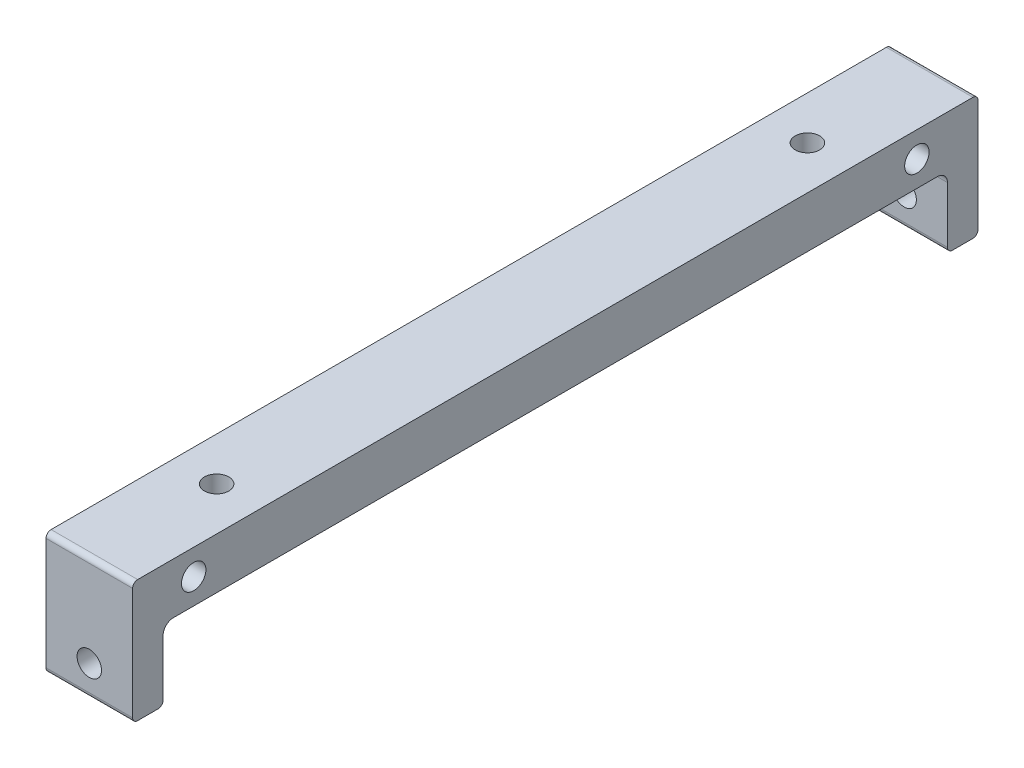
ISO-10303-21;
HEADER;
FILE_DESCRIPTION(('STEP AP214'),'2;1');
FILE_NAME('part.step','',(''),(''),'','','');
FILE_SCHEMA(('AUTOMOTIVE_DESIGN { 1 0 10303 214 1 1 1 1 }'));
ENDSEC;
DATA;
#1=APPLICATION_CONTEXT('core data for automotive mechanical design processes');
#2=APPLICATION_PROTOCOL_DEFINITION('international standard','automotive_design',2000,#1);
#3=PRODUCT_CONTEXT('',#1,'mechanical');
#4=PRODUCT('Part','Part','',(#3));
#5=PRODUCT_RELATED_PRODUCT_CATEGORY('part','',(#4));
#6=PRODUCT_DEFINITION_FORMATION('','',#4);
#7=PRODUCT_DEFINITION_CONTEXT('part definition',#1,'design');
#8=PRODUCT_DEFINITION('design','',#6,#7);
#9=PRODUCT_DEFINITION_SHAPE('','',#8);
#10=(LENGTH_UNIT() NAMED_UNIT(*) SI_UNIT(.MILLI.,.METRE.));
#11=(NAMED_UNIT(*) PLANE_ANGLE_UNIT() SI_UNIT($,.RADIAN.));
#12=(NAMED_UNIT(*) SI_UNIT($,.STERADIAN.) SOLID_ANGLE_UNIT());
#13=UNCERTAINTY_MEASURE_WITH_UNIT(LENGTH_MEASURE(1.E-05),#10,'distance_accuracy_value','');
#14=(GEOMETRIC_REPRESENTATION_CONTEXT(3) GLOBAL_UNCERTAINTY_ASSIGNED_CONTEXT((#13)) GLOBAL_UNIT_ASSIGNED_CONTEXT((#10,
#11,#12)) REPRESENTATION_CONTEXT('',''));
#15=CARTESIAN_POINT('',(0.,0.,0.));
#16=DIRECTION('',(0.,0.,1.));
#17=DIRECTION('',(1.,0.,0.));
#18=AXIS2_PLACEMENT_3D('',#15,#16,#17);
#19=CARTESIAN_POINT('',(-4.25,-6.,41.5));
#20=DIRECTION('',(0.,1.,0.));
#21=DIRECTION('',(0.,0.,1.));
#22=AXIS2_PLACEMENT_3D('',#19,#20,#21);
#23=PLANE('',#22);
#24=DIRECTION('',(0.,0.,-1.));
#25=VECTOR('',#24,1.);
#26=CARTESIAN_POINT('',(-4.25,-6.,41.5));
#27=LINE('',#26,#25);
#28=CARTESIAN_POINT('',(-4.25,-6.,41.));
#29=VERTEX_POINT('',#28);
#30=CARTESIAN_POINT('',(-4.25,-6.,39.));
#31=VERTEX_POINT('',#30);
#32=EDGE_CURVE('E274',#29,#31,#27,.T.);
#33=ORIENTED_EDGE('',*,*,#32,.T.);
#34=DIRECTION('',(1.,0.,0.));
#35=VECTOR('',#34,1.);
#36=CARTESIAN_POINT('',(-4.25,-6.,39.));
#37=LINE('',#36,#35);
#38=CARTESIAN_POINT('',(4.25,-6.,39.));
#39=VERTEX_POINT('',#38);
#40=EDGE_CURVE('E319',#31,#39,#37,.T.);
#41=ORIENTED_EDGE('',*,*,#40,.T.);
#42=DIRECTION('',(0.,0.,-1.));
#43=VECTOR('',#42,1.);
#44=CARTESIAN_POINT('',(4.25,-6.,41.5));
#45=LINE('',#44,#43);
#46=CARTESIAN_POINT('',(4.25,-6.,41.));
#47=VERTEX_POINT('',#46);
#48=EDGE_CURVE('E270',#47,#39,#45,.T.);
#49=ORIENTED_EDGE('',*,*,#48,.F.);
#50=DIRECTION('',(1.,0.,0.));
#51=VECTOR('',#50,1.);
#52=CARTESIAN_POINT('',(-4.25,-6.,41.));
#53=LINE('',#52,#51);
#54=EDGE_CURVE('E317',#47,#29,#53,.F.);
#55=ORIENTED_EDGE('',*,*,#54,.T.);
#56=EDGE_LOOP('',(#33,#41,#49,#55));
#57=FACE_BOUND('',#56,.T.);
#58=ADVANCED_FACE('F34',(#57),#23,.F.);
#59=CARTESIAN_POINT('',(4.25,-6.,41.5));
#60=DIRECTION('',(-1.,0.,0.));
#61=DIRECTION('',(0.,0.,1.));
#62=AXIS2_PLACEMENT_3D('',#59,#60,#61);
#63=PLANE('',#62);
#64=CARTESIAN_POINT('',(4.25,3.5,35.5));
#65=DIRECTION('',(1.,0.,0.));
#66=DIRECTION('',(0.,0.,-1.));
#67=AXIS2_PLACEMENT_3D('',#64,#65,#66);
#68=CIRCLE('',#67,1.2);
#69=CARTESIAN_POINT('',(4.25,3.5,34.3));
#70=VERTEX_POINT('',#69);
#71=EDGE_CURVE('E208',#70,#70,#68,.T.);
#72=ORIENTED_EDGE('',*,*,#71,.F.);
#73=EDGE_LOOP('',(#72));
#74=FACE_BOUND('',#73,.T.);
#75=CARTESIAN_POINT('',(4.25,3.5,-35.5));
#76=DIRECTION('',(1.,0.,0.));
#77=DIRECTION('',(0.,0.,-1.));
#78=AXIS2_PLACEMENT_3D('',#75,#76,#77);
#79=CIRCLE('',#78,1.2);
#80=CARTESIAN_POINT('',(4.25,3.5,-36.7));
#81=VERTEX_POINT('',#80);
#82=EDGE_CURVE('E214',#81,#81,#79,.T.);
#83=ORIENTED_EDGE('',*,*,#82,.F.);
#84=EDGE_LOOP('',(#83));
#85=FACE_BOUND('',#84,.T.);
#86=CARTESIAN_POINT('',(4.25,-6.,-39.));
#87=VERTEX_POINT('',#86);
#88=CARTESIAN_POINT('',(4.25,-6.,-41.));
#89=VERTEX_POINT('',#88);
#90=EDGE_CURVE('E265',#87,#89,#45,.T.);
#91=ORIENTED_EDGE('',*,*,#90,.T.);
#92=CARTESIAN_POINT('',(4.25,-5.5,-41.));
#93=DIRECTION('',(-1.,0.,0.));
#94=DIRECTION('',(0.,0.,1.));
#95=AXIS2_PLACEMENT_3D('',#92,#93,#94);
#96=CIRCLE('',#95,0.5);
#97=CARTESIAN_POINT('',(4.25,-5.5,-41.5));
#98=VERTEX_POINT('',#97);
#99=EDGE_CURVE('E298',#89,#98,#96,.F.);
#100=ORIENTED_EDGE('',*,*,#99,.T.);
#101=DIRECTION('',(0.,1.,0.));
#102=VECTOR('',#101,1.);
#103=CARTESIAN_POINT('',(4.25,-6.,-41.5));
#104=LINE('',#103,#102);
#105=CARTESIAN_POINT('',(4.25,5.5,-41.5));
#106=VERTEX_POINT('',#105);
#107=EDGE_CURVE('E251',#98,#106,#104,.T.);
#108=ORIENTED_EDGE('',*,*,#107,.T.);
#109=CARTESIAN_POINT('',(4.25,5.5,-41.));
#110=DIRECTION('',(-1.,0.,0.));
#111=DIRECTION('',(0.,0.,1.));
#112=AXIS2_PLACEMENT_3D('',#109,#110,#111);
#113=CIRCLE('',#112,0.5);
#114=CARTESIAN_POINT('',(4.25,6.,-41.));
#115=VERTEX_POINT('',#114);
#116=EDGE_CURVE('E290',#106,#115,#113,.F.);
#117=ORIENTED_EDGE('',*,*,#116,.T.);
#118=DIRECTION('',(0.,0.,-1.));
#119=VECTOR('',#118,1.);
#120=CARTESIAN_POINT('',(4.25,6.,41.5));
#121=LINE('',#120,#119);
#122=CARTESIAN_POINT('',(4.25,6.,41.));
#123=VERTEX_POINT('',#122);
#124=EDGE_CURVE('E280',#123,#115,#121,.T.);
#125=ORIENTED_EDGE('',*,*,#124,.F.);
#126=CARTESIAN_POINT('',(4.25,5.5,41.));
#127=DIRECTION('',(-1.,0.,0.));
#128=DIRECTION('',(0.,0.,1.));
#129=AXIS2_PLACEMENT_3D('',#126,#127,#128);
#130=CIRCLE('',#129,0.5);
#131=CARTESIAN_POINT('',(4.25,5.5,41.5));
#132=VERTEX_POINT('',#131);
#133=EDGE_CURVE('E288',#123,#132,#130,.F.);
#134=ORIENTED_EDGE('',*,*,#133,.T.);
#135=DIRECTION('',(0.,1.,0.));
#136=VECTOR('',#135,1.);
#137=CARTESIAN_POINT('',(4.25,-6.,41.5));
#138=LINE('',#137,#136);
#139=CARTESIAN_POINT('',(4.25,-5.5,41.5));
#140=VERTEX_POINT('',#139);
#141=EDGE_CURVE('E258',#140,#132,#138,.T.);
#142=ORIENTED_EDGE('',*,*,#141,.F.);
#143=CARTESIAN_POINT('',(4.25,-5.5,41.));
#144=DIRECTION('',(-1.,0.,0.));
#145=DIRECTION('',(0.,0.,1.));
#146=AXIS2_PLACEMENT_3D('',#143,#144,#145);
#147=CIRCLE('',#146,0.5);
#148=EDGE_CURVE('E292',#140,#47,#147,.F.);
#149=ORIENTED_EDGE('',*,*,#148,.T.);
#150=ORIENTED_EDGE('',*,*,#48,.T.);
#151=CARTESIAN_POINT('',(4.25,-5.5,39.));
#152=DIRECTION('',(-1.,0.,0.));
#153=DIRECTION('',(0.,0.,1.));
#154=AXIS2_PLACEMENT_3D('',#151,#152,#153);
#155=CIRCLE('',#154,0.5);
#156=CARTESIAN_POINT('',(4.25,-5.5,38.5));
#157=VERTEX_POINT('',#156);
#158=EDGE_CURVE('E294',#39,#157,#155,.F.);
#159=ORIENTED_EDGE('',*,*,#158,.T.);
#160=DIRECTION('',(0.,-1.,0.));
#161=VECTOR('',#160,1.);
#162=CARTESIAN_POINT('',(4.25,-6.00000000000001,38.5));
#163=LINE('',#162,#161);
#164=CARTESIAN_POINT('',(4.25,0.,38.5));
#165=VERTEX_POINT('',#164);
#166=EDGE_CURVE('E224',#165,#157,#163,.T.);
#167=ORIENTED_EDGE('',*,*,#166,.F.);
#168=CARTESIAN_POINT('',(4.25,0.,37.5));
#169=DIRECTION('',(1.,0.,0.));
#170=DIRECTION('',(0.,0.,-1.));
#171=AXIS2_PLACEMENT_3D('',#168,#169,#170);
#172=CIRCLE('',#171,1.);
#173=CARTESIAN_POINT('',(4.25,1.,37.5));
#174=VERTEX_POINT('',#173);
#175=EDGE_CURVE('E244',#174,#165,#172,.T.);
#176=ORIENTED_EDGE('',*,*,#175,.F.);
#177=DIRECTION('',(0.,0.,1.));
#178=VECTOR('',#177,1.);
#179=CARTESIAN_POINT('',(4.25,1.,37.5));
#180=LINE('',#179,#178);
#181=CARTESIAN_POINT('',(4.25,1.,-37.5));
#182=VERTEX_POINT('',#181);
#183=EDGE_CURVE('E241',#182,#174,#180,.T.);
#184=ORIENTED_EDGE('',*,*,#183,.F.);
#185=CARTESIAN_POINT('',(4.25,0.,-37.5));
#186=DIRECTION('',(1.,0.,0.));
#187=DIRECTION('',(0.,0.,1.));
#188=AXIS2_PLACEMENT_3D('',#185,#186,#187);
#189=CIRCLE('',#188,1.);
#190=CARTESIAN_POINT('',(4.25,0.,-38.5));
#191=VERTEX_POINT('',#190);
#192=EDGE_CURVE('E238',#191,#182,#189,.T.);
#193=ORIENTED_EDGE('',*,*,#192,.F.);
#194=DIRECTION('',(0.,1.,0.));
#195=VECTOR('',#194,1.);
#196=CARTESIAN_POINT('',(4.25,0.,-38.5));
#197=LINE('',#196,#195);
#198=CARTESIAN_POINT('',(4.25,-5.5,-38.5));
#199=VERTEX_POINT('',#198);
#200=EDGE_CURVE('E220',#199,#191,#197,.T.);
#201=ORIENTED_EDGE('',*,*,#200,.F.);
#202=CARTESIAN_POINT('',(4.25,-5.5,-39.));
#203=DIRECTION('',(-1.,0.,0.));
#204=DIRECTION('',(0.,0.,1.));
#205=AXIS2_PLACEMENT_3D('',#202,#203,#204);
#206=CIRCLE('',#205,0.5);
#207=EDGE_CURVE('E296',#199,#87,#206,.F.);
#208=ORIENTED_EDGE('',*,*,#207,.T.);
#209=EDGE_LOOP('',(#91,#100,#108,#117,#125,#134,#142,#149,#150,#159,#167,#176,#184,#193,#201,#208));
#210=FACE_BOUND('',#209,.T.);
#211=ADVANCED_FACE('F338',(#74,#85,#210),#63,.F.);
#212=CARTESIAN_POINT('',(-4.25,6.,41.5));
#213=DIRECTION('',(0.,-1.,0.));
#214=DIRECTION('',(0.,0.,-1.));
#215=AXIS2_PLACEMENT_3D('',#212,#213,#214);
#216=PLANE('',#215);
#217=CARTESIAN_POINT('',(0.,6.,-29.));
#218=DIRECTION('',(0.,1.,0.));
#219=DIRECTION('',(0.,0.,1.));
#220=AXIS2_PLACEMENT_3D('',#217,#218,#219);
#221=CIRCLE('',#220,1.2);
#222=CARTESIAN_POINT('',(0.,6.,-27.8));
#223=VERTEX_POINT('',#222);
#224=EDGE_CURVE('E171',#223,#223,#221,.T.);
#225=ORIENTED_EDGE('',*,*,#224,.F.);
#226=EDGE_LOOP('',(#225));
#227=FACE_BOUND('',#226,.T.);
#228=CARTESIAN_POINT('',(0.,6.,29.));
#229=DIRECTION('',(0.,1.,0.));
#230=DIRECTION('',(0.,0.,1.));
#231=AXIS2_PLACEMENT_3D('',#228,#229,#230);
#232=CIRCLE('',#231,1.2);
#233=CARTESIAN_POINT('',(0.,6.,30.2));
#234=VERTEX_POINT('',#233);
#235=EDGE_CURVE('E184',#234,#234,#232,.T.);
#236=ORIENTED_EDGE('',*,*,#235,.F.);
#237=EDGE_LOOP('',(#236));
#238=FACE_BOUND('',#237,.T.);
#239=ORIENTED_EDGE('',*,*,#124,.T.);
#240=DIRECTION('',(-1.,0.,0.));
#241=VECTOR('',#240,1.);
#242=CARTESIAN_POINT('',(-4.25,6.,-41.));
#243=LINE('',#242,#241);
#244=CARTESIAN_POINT('',(-4.25,6.,-41.));
#245=VERTEX_POINT('',#244);
#246=EDGE_CURVE('E11',#115,#245,#243,.T.);
#247=ORIENTED_EDGE('',*,*,#246,.T.);
#248=DIRECTION('',(0.,0.,-1.));
#249=VECTOR('',#248,1.);
#250=CARTESIAN_POINT('',(-4.25,6.,41.5));
#251=LINE('',#250,#249);
#252=CARTESIAN_POINT('',(-4.25,6.,41.));
#253=VERTEX_POINT('',#252);
#254=EDGE_CURVE('E277',#253,#245,#251,.T.);
#255=ORIENTED_EDGE('',*,*,#254,.F.);
#256=DIRECTION('',(-1.,0.,0.));
#257=VECTOR('',#256,1.);
#258=CARTESIAN_POINT('',(-4.25,6.,41.));
#259=LINE('',#258,#257);
#260=EDGE_CURVE('E42',#253,#123,#259,.F.);
#261=ORIENTED_EDGE('',*,*,#260,.T.);
#262=EDGE_LOOP('',(#239,#247,#255,#261));
#263=FACE_BOUND('',#262,.T.);
#264=ADVANCED_FACE('F333',(#227,#238,#263),#216,.F.);
#265=CARTESIAN_POINT('',(-4.25,-6.,41.5));
#266=DIRECTION('',(1.,0.,0.));
#267=DIRECTION('',(0.,0.,-1.));
#268=AXIS2_PLACEMENT_3D('',#265,#266,#267);
#269=PLANE('',#268);
#270=CARTESIAN_POINT('',(-4.25,3.5,0.));
#271=DIRECTION('',(-1.,0.,0.));
#272=DIRECTION('',(0.,0.,1.));
#273=AXIS2_PLACEMENT_3D('',#270,#271,#272);
#274=CIRCLE('',#273,1.2);
#275=CARTESIAN_POINT('',(-4.25,3.5,1.2));
#276=VERTEX_POINT('',#275);
#277=EDGE_CURVE('E172',#276,#276,#274,.T.);
#278=ORIENTED_EDGE('',*,*,#277,.F.);
#279=EDGE_LOOP('',(#278));
#280=FACE_BOUND('',#279,.T.);
#281=CARTESIAN_POINT('',(-4.25,3.5,-21.5));
#282=DIRECTION('',(-1.,0.,0.));
#283=DIRECTION('',(0.,0.,1.));
#284=AXIS2_PLACEMENT_3D('',#281,#282,#283);
#285=CIRCLE('',#284,1.2);
#286=CARTESIAN_POINT('',(-4.25,3.5,-20.3));
#287=VERTEX_POINT('',#286);
#288=EDGE_CURVE('E196',#287,#287,#285,.T.);
#289=ORIENTED_EDGE('',*,*,#288,.F.);
#290=EDGE_LOOP('',(#289));
#291=FACE_BOUND('',#290,.T.);
#292=CARTESIAN_POINT('',(-4.25,3.5,21.5));
#293=DIRECTION('',(-1.,0.,0.));
#294=DIRECTION('',(0.,0.,1.));
#295=AXIS2_PLACEMENT_3D('',#292,#293,#294);
#296=CIRCLE('',#295,1.2);
#297=CARTESIAN_POINT('',(-4.25,3.5,22.7));
#298=VERTEX_POINT('',#297);
#299=EDGE_CURVE('E202',#298,#298,#296,.T.);
#300=ORIENTED_EDGE('',*,*,#299,.F.);
#301=EDGE_LOOP('',(#300));
#302=FACE_BOUND('',#301,.T.);
#303=DIRECTION('',(0.,-1.,0.));
#304=VECTOR('',#303,1.);
#305=CARTESIAN_POINT('',(-4.25,-6.,-41.5));
#306=LINE('',#305,#304);
#307=CARTESIAN_POINT('',(-4.25,5.5,-41.5));
#308=VERTEX_POINT('',#307);
#309=CARTESIAN_POINT('',(-4.25,-5.5,-41.5));
#310=VERTEX_POINT('',#309);
#311=EDGE_CURVE('E262',#308,#310,#306,.T.);
#312=ORIENTED_EDGE('',*,*,#311,.T.);
#313=CARTESIAN_POINT('',(-4.25,-5.5,-41.));
#314=DIRECTION('',(1.,0.,0.));
#315=DIRECTION('',(0.,0.,-1.));
#316=AXIS2_PLACEMENT_3D('',#313,#314,#315);
#317=CIRCLE('',#316,0.5);
#318=CARTESIAN_POINT('',(-4.25,-6.,-41.));
#319=VERTEX_POINT('',#318);
#320=EDGE_CURVE('E312',#310,#319,#317,.F.);
#321=ORIENTED_EDGE('',*,*,#320,.T.);
#322=CARTESIAN_POINT('',(-4.25,-6.,-39.));
#323=VERTEX_POINT('',#322);
#324=EDGE_CURVE('E273',#323,#319,#27,.T.);
#325=ORIENTED_EDGE('',*,*,#324,.F.);
#326=CARTESIAN_POINT('',(-4.25,-5.5,-39.));
#327=DIRECTION('',(1.,0.,0.));
#328=DIRECTION('',(0.,0.,-1.));
#329=AXIS2_PLACEMENT_3D('',#326,#327,#328);
#330=CIRCLE('',#329,0.5);
#331=CARTESIAN_POINT('',(-4.25,-5.5,-38.5));
#332=VERTEX_POINT('',#331);
#333=EDGE_CURVE('E49',#323,#332,#330,.F.);
#334=ORIENTED_EDGE('',*,*,#333,.T.);
#335=DIRECTION('',(0.,1.,0.));
#336=VECTOR('',#335,1.);
#337=CARTESIAN_POINT('',(-4.25,0.,-38.5));
#338=LINE('',#337,#336);
#339=CARTESIAN_POINT('',(-4.25,0.,-38.5));
#340=VERTEX_POINT('',#339);
#341=EDGE_CURVE('E221',#332,#340,#338,.T.);
#342=ORIENTED_EDGE('',*,*,#341,.T.);
#343=CARTESIAN_POINT('',(-4.25,0.,-37.5));
#344=DIRECTION('',(1.,0.,0.));
#345=DIRECTION('',(0.,0.,1.));
#346=AXIS2_PLACEMENT_3D('',#343,#344,#345);
#347=CIRCLE('',#346,1.);
#348=CARTESIAN_POINT('',(-4.25,1.,-37.5));
#349=VERTEX_POINT('',#348);
#350=EDGE_CURVE('E223',#340,#349,#347,.T.);
#351=ORIENTED_EDGE('',*,*,#350,.T.);
#352=DIRECTION('',(0.,0.,1.));
#353=VECTOR('',#352,1.);
#354=CARTESIAN_POINT('',(-4.25,1.,37.5));
#355=LINE('',#354,#353);
#356=CARTESIAN_POINT('',(-4.25,1.,37.5));
#357=VERTEX_POINT('',#356);
#358=EDGE_CURVE('E227',#349,#357,#355,.T.);
#359=ORIENTED_EDGE('',*,*,#358,.T.);
#360=CARTESIAN_POINT('',(-4.25,0.,37.5));
#361=DIRECTION('',(1.,0.,0.));
#362=DIRECTION('',(0.,0.,-1.));
#363=AXIS2_PLACEMENT_3D('',#360,#361,#362);
#364=CIRCLE('',#363,1.);
#365=CARTESIAN_POINT('',(-4.25,0.,38.5));
#366=VERTEX_POINT('',#365);
#367=EDGE_CURVE('E230',#357,#366,#364,.T.);
#368=ORIENTED_EDGE('',*,*,#367,.T.);
#369=DIRECTION('',(0.,-1.,0.));
#370=VECTOR('',#369,1.);
#371=CARTESIAN_POINT('',(-4.25,-6.00000000000001,38.5));
#372=LINE('',#371,#370);
#373=CARTESIAN_POINT('',(-4.25,-5.5,38.5));
#374=VERTEX_POINT('',#373);
#375=EDGE_CURVE('E233',#366,#374,#372,.T.);
#376=ORIENTED_EDGE('',*,*,#375,.T.);
#377=CARTESIAN_POINT('',(-4.25,-5.5,39.));
#378=DIRECTION('',(1.,0.,0.));
#379=DIRECTION('',(0.,0.,-1.));
#380=AXIS2_PLACEMENT_3D('',#377,#378,#379);
#381=CIRCLE('',#380,0.5);
#382=EDGE_CURVE('E309',#374,#31,#381,.F.);
#383=ORIENTED_EDGE('',*,*,#382,.T.);
#384=ORIENTED_EDGE('',*,*,#32,.F.);
#385=CARTESIAN_POINT('',(-4.25,-5.5,41.));
#386=DIRECTION('',(1.,0.,0.));
#387=DIRECTION('',(0.,0.,-1.));
#388=AXIS2_PLACEMENT_3D('',#385,#386,#387);
#389=CIRCLE('',#388,0.5);
#390=CARTESIAN_POINT('',(-4.25,-5.5,41.5));
#391=VERTEX_POINT('',#390);
#392=EDGE_CURVE('E307',#29,#391,#389,.F.);
#393=ORIENTED_EDGE('',*,*,#392,.T.);
#394=DIRECTION('',(0.,-1.,0.));
#395=VECTOR('',#394,1.);
#396=CARTESIAN_POINT('',(-4.25,-6.,41.5));
#397=LINE('',#396,#395);
#398=CARTESIAN_POINT('',(-4.25,5.5,41.5));
#399=VERTEX_POINT('',#398);
#400=EDGE_CURVE('E261',#399,#391,#397,.T.);
#401=ORIENTED_EDGE('',*,*,#400,.F.);
#402=CARTESIAN_POINT('',(-4.25,5.5,41.));
#403=DIRECTION('',(1.,0.,0.));
#404=DIRECTION('',(0.,0.,-1.));
#405=AXIS2_PLACEMENT_3D('',#402,#403,#404);
#406=CIRCLE('',#405,0.5);
#407=EDGE_CURVE('E304',#399,#253,#406,.F.);
#408=ORIENTED_EDGE('',*,*,#407,.T.);
#409=ORIENTED_EDGE('',*,*,#254,.T.);
#410=CARTESIAN_POINT('',(-4.25,5.5,-41.));
#411=DIRECTION('',(1.,0.,0.));
#412=DIRECTION('',(0.,0.,-1.));
#413=AXIS2_PLACEMENT_3D('',#410,#411,#412);
#414=CIRCLE('',#413,0.5);
#415=EDGE_CURVE('E57',#245,#308,#414,.F.);
#416=ORIENTED_EDGE('',*,*,#415,.T.);
#417=EDGE_LOOP('',(#312,#321,#325,#334,#342,#351,#359,#368,#376,#383,#384,#393,#401,#408,#409,#416));
#418=FACE_BOUND('',#417,.T.);
#419=ADVANCED_FACE('F346',(#280,#291,#302,#418),#269,.F.);
#420=ORIENTED_EDGE('',*,*,#324,.T.);
#421=DIRECTION('',(1.,0.,0.));
#422=VECTOR('',#421,1.);
#423=CARTESIAN_POINT('',(4.25,-6.,-41.));
#424=LINE('',#423,#422);
#425=EDGE_CURVE('E285',#319,#89,#424,.T.);
#426=ORIENTED_EDGE('',*,*,#425,.T.);
#427=ORIENTED_EDGE('',*,*,#90,.F.);
#428=DIRECTION('',(1.,0.,0.));
#429=VECTOR('',#428,1.);
#430=CARTESIAN_POINT('',(-4.25,-6.,-39.));
#431=LINE('',#430,#429);
#432=EDGE_CURVE('E283',#87,#323,#431,.F.);
#433=ORIENTED_EDGE('',*,*,#432,.T.);
#434=EDGE_LOOP('',(#420,#426,#427,#433));
#435=FACE_BOUND('',#434,.T.);
#436=ADVANCED_FACE('F385',(#435),#23,.F.);
#437=CARTESIAN_POINT('',(0.,0.,41.5));
#438=DIRECTION('',(0.,0.,-1.));
#439=DIRECTION('',(-1.,0.,0.));
#440=AXIS2_PLACEMENT_3D('',#437,#438,#439);
#441=PLANE('',#440);
#442=CARTESIAN_POINT('',(0.,-3.,41.5));
#443=DIRECTION('',(0.,0.,1.));
#444=DIRECTION('',(1.,0.,0.));
#445=AXIS2_PLACEMENT_3D('',#442,#443,#444);
#446=CIRCLE('',#445,1.2);
#447=CARTESIAN_POINT('',(1.2,-3.,41.5));
#448=VERTEX_POINT('',#447);
#449=EDGE_CURVE('E190',#448,#448,#446,.T.);
#450=ORIENTED_EDGE('',*,*,#449,.F.);
#451=EDGE_LOOP('',(#450));
#452=FACE_BOUND('',#451,.T.);
#453=ORIENTED_EDGE('',*,*,#400,.T.);
#454=DIRECTION('',(1.,0.,0.));
#455=VECTOR('',#454,1.);
#456=CARTESIAN_POINT('',(0.,-5.5,41.5));
#457=LINE('',#456,#455);
#458=EDGE_CURVE('E327',#391,#140,#457,.T.);
#459=ORIENTED_EDGE('',*,*,#458,.T.);
#460=ORIENTED_EDGE('',*,*,#141,.T.);
#461=DIRECTION('',(-1.,0.,0.));
#462=VECTOR('',#461,1.);
#463=CARTESIAN_POINT('',(0.,5.5,41.5));
#464=LINE('',#463,#462);
#465=EDGE_CURVE('E324',#132,#399,#464,.T.);
#466=ORIENTED_EDGE('',*,*,#465,.T.);
#467=EDGE_LOOP('',(#453,#459,#460,#466));
#468=FACE_BOUND('',#467,.T.);
#469=ADVANCED_FACE('F344',(#452,#468),#441,.F.);
#470=CARTESIAN_POINT('',(0.,0.,-41.5));
#471=DIRECTION('',(0.,0.,-1.));
#472=DIRECTION('',(-1.,0.,0.));
#473=AXIS2_PLACEMENT_3D('',#470,#471,#472);
#474=PLANE('',#473);
#475=CARTESIAN_POINT('',(0.,-3.,-41.5));
#476=DIRECTION('',(0.,0.,-1.));
#477=DIRECTION('',(-1.,0.,0.));
#478=AXIS2_PLACEMENT_3D('',#475,#476,#477);
#479=CIRCLE('',#478,1.19999999999999);
#480=CARTESIAN_POINT('',(-1.19999999999999,-3.,-41.5));
#481=VERTEX_POINT('',#480);
#482=EDGE_CURVE('E480',#481,#481,#479,.T.);
#483=ORIENTED_EDGE('',*,*,#482,.F.);
#484=EDGE_LOOP('',(#483));
#485=FACE_BOUND('',#484,.T.);
#486=ORIENTED_EDGE('',*,*,#107,.F.);
#487=DIRECTION('',(1.,0.,0.));
#488=VECTOR('',#487,1.);
#489=CARTESIAN_POINT('',(-4.25,-5.5,-41.5));
#490=LINE('',#489,#488);
#491=EDGE_CURVE('E302',#98,#310,#490,.F.);
#492=ORIENTED_EDGE('',*,*,#491,.T.);
#493=ORIENTED_EDGE('',*,*,#311,.F.);
#494=DIRECTION('',(-1.,0.,0.));
#495=VECTOR('',#494,1.);
#496=CARTESIAN_POINT('',(4.25,5.5,-41.5));
#497=LINE('',#496,#495);
#498=EDGE_CURVE('E300',#308,#106,#497,.F.);
#499=ORIENTED_EDGE('',*,*,#498,.T.);
#500=EDGE_LOOP('',(#486,#492,#493,#499));
#501=FACE_BOUND('',#500,.T.);
#502=ADVANCED_FACE('F412',(#485,#501),#474,.T.);
#503=CARTESIAN_POINT('',(-4.25,-6.00000000000001,38.5));
#504=DIRECTION('',(0.,0.,1.));
#505=DIRECTION('',(1.,0.,0.));
#506=AXIS2_PLACEMENT_3D('',#503,#504,#505);
#507=PLANE('',#506);
#508=CARTESIAN_POINT('',(0.,-3.,38.5));
#509=DIRECTION('',(0.,0.,1.));
#510=DIRECTION('',(1.,0.,0.));
#511=AXIS2_PLACEMENT_3D('',#508,#509,#510);
#512=CIRCLE('',#511,1.2);
#513=CARTESIAN_POINT('',(1.2,-3.,38.5));
#514=VERTEX_POINT('',#513);
#515=EDGE_CURVE('E193',#514,#514,#512,.T.);
#516=ORIENTED_EDGE('',*,*,#515,.T.);
#517=EDGE_LOOP('',(#516));
#518=FACE_BOUND('',#517,.T.);
#519=ORIENTED_EDGE('',*,*,#166,.T.);
#520=DIRECTION('',(1.,0.,0.));
#521=VECTOR('',#520,1.);
#522=CARTESIAN_POINT('',(-4.25,-5.5,38.5));
#523=LINE('',#522,#521);
#524=EDGE_CURVE('E322',#157,#374,#523,.F.);
#525=ORIENTED_EDGE('',*,*,#524,.T.);
#526=ORIENTED_EDGE('',*,*,#375,.F.);
#527=DIRECTION('',(1.,0.,0.));
#528=VECTOR('',#527,1.);
#529=CARTESIAN_POINT('',(-4.25,0.,38.5));
#530=LINE('',#529,#528);
#531=EDGE_CURVE('E249',#366,#165,#530,.T.);
#532=ORIENTED_EDGE('',*,*,#531,.T.);
#533=EDGE_LOOP('',(#519,#525,#526,#532));
#534=FACE_BOUND('',#533,.T.);
#535=ADVANCED_FACE('F362',(#518,#534),#507,.F.);
#536=CARTESIAN_POINT('',(-4.25,0.,37.5));
#537=DIRECTION('',(1.,0.,0.));
#538=DIRECTION('',(0.,0.,-1.));
#539=AXIS2_PLACEMENT_3D('',#536,#537,#538);
#540=CYLINDRICAL_SURFACE('',#539,1.);
#541=ORIENTED_EDGE('',*,*,#175,.T.);
#542=ORIENTED_EDGE('',*,*,#531,.F.);
#543=ORIENTED_EDGE('',*,*,#367,.F.);
#544=DIRECTION('',(1.,0.,0.));
#545=VECTOR('',#544,1.);
#546=CARTESIAN_POINT('',(-4.25,1.,37.5));
#547=LINE('',#546,#545);
#548=EDGE_CURVE('E252',#357,#174,#547,.T.);
#549=ORIENTED_EDGE('',*,*,#548,.T.);
#550=EDGE_LOOP('',(#541,#542,#543,#549));
#551=FACE_BOUND('',#550,.T.);
#552=ADVANCED_FACE('F366',(#551),#540,.F.);
#553=CARTESIAN_POINT('',(-4.25,1.,37.5));
#554=DIRECTION('',(0.,1.,0.));
#555=DIRECTION('',(0.,0.,1.));
#556=AXIS2_PLACEMENT_3D('',#553,#554,#555);
#557=PLANE('',#556);
#558=CARTESIAN_POINT('',(0.,1.,-29.));
#559=DIRECTION('',(0.,1.,0.));
#560=DIRECTION('',(0.,0.,1.));
#561=AXIS2_PLACEMENT_3D('',#558,#559,#560);
#562=CIRCLE('',#561,1.2);
#563=CARTESIAN_POINT('',(0.,1.,-27.8));
#564=VERTEX_POINT('',#563);
#565=EDGE_CURVE('E175',#564,#564,#562,.T.);
#566=ORIENTED_EDGE('',*,*,#565,.T.);
#567=EDGE_LOOP('',(#566));
#568=FACE_BOUND('',#567,.T.);
#569=CARTESIAN_POINT('',(0.,1.,29.));
#570=DIRECTION('',(0.,1.,0.));
#571=DIRECTION('',(0.,0.,1.));
#572=AXIS2_PLACEMENT_3D('',#569,#570,#571);
#573=CIRCLE('',#572,1.2);
#574=CARTESIAN_POINT('',(0.,1.,30.2));
#575=VERTEX_POINT('',#574);
#576=EDGE_CURVE('E187',#575,#575,#573,.T.);
#577=ORIENTED_EDGE('',*,*,#576,.T.);
#578=EDGE_LOOP('',(#577));
#579=FACE_BOUND('',#578,.T.);
#580=ORIENTED_EDGE('',*,*,#183,.T.);
#581=ORIENTED_EDGE('',*,*,#548,.F.);
#582=ORIENTED_EDGE('',*,*,#358,.F.);
#583=DIRECTION('',(1.,0.,0.));
#584=VECTOR('',#583,1.);
#585=CARTESIAN_POINT('',(-4.25,1.,-37.5));
#586=LINE('',#585,#584);
#587=EDGE_CURVE('E254',#349,#182,#586,.T.);
#588=ORIENTED_EDGE('',*,*,#587,.T.);
#589=EDGE_LOOP('',(#580,#581,#582,#588));
#590=FACE_BOUND('',#589,.T.);
#591=ADVANCED_FACE('F371',(#568,#579,#590),#557,.F.);
#592=CARTESIAN_POINT('',(-4.25,0.,-37.5));
#593=DIRECTION('',(1.,0.,0.));
#594=DIRECTION('',(0.,0.,-1.));
#595=AXIS2_PLACEMENT_3D('',#592,#593,#594);
#596=CYLINDRICAL_SURFACE('',#595,1.);
#597=ORIENTED_EDGE('',*,*,#192,.T.);
#598=ORIENTED_EDGE('',*,*,#587,.F.);
#599=ORIENTED_EDGE('',*,*,#350,.F.);
#600=DIRECTION('',(1.,0.,0.));
#601=VECTOR('',#600,1.);
#602=CARTESIAN_POINT('',(-4.25,0.,-38.5));
#603=LINE('',#602,#601);
#604=EDGE_CURVE('E236',#340,#191,#603,.T.);
#605=ORIENTED_EDGE('',*,*,#604,.T.);
#606=EDGE_LOOP('',(#597,#598,#599,#605));
#607=FACE_BOUND('',#606,.T.);
#608=ADVANCED_FACE('F375',(#607),#596,.F.);
#609=CARTESIAN_POINT('',(-4.25,0.,-38.5));
#610=DIRECTION('',(0.,0.,-1.));
#611=DIRECTION('',(0.,1.,0.));
#612=AXIS2_PLACEMENT_3D('',#609,#610,#611);
#613=PLANE('',#612);
#614=CARTESIAN_POINT('',(0.,-3.,-38.5));
#615=DIRECTION('',(0.,0.,-1.));
#616=DIRECTION('',(0.,1.,0.));
#617=AXIS2_PLACEMENT_3D('',#614,#615,#616);
#618=CIRCLE('',#617,1.19999999999999);
#619=CARTESIAN_POINT('',(0.,-1.80000000000001,-38.5));
#620=VERTEX_POINT('',#619);
#621=EDGE_CURVE('E178',#620,#620,#618,.T.);
#622=ORIENTED_EDGE('',*,*,#621,.T.);
#623=EDGE_LOOP('',(#622));
#624=FACE_BOUND('',#623,.T.);
#625=ORIENTED_EDGE('',*,*,#341,.F.);
#626=DIRECTION('',(1.,0.,0.));
#627=VECTOR('',#626,1.);
#628=CARTESIAN_POINT('',(-4.25,-5.5,-38.5));
#629=LINE('',#628,#627);
#630=EDGE_CURVE('E314',#332,#199,#629,.T.);
#631=ORIENTED_EDGE('',*,*,#630,.T.);
#632=ORIENTED_EDGE('',*,*,#200,.T.);
#633=ORIENTED_EDGE('',*,*,#604,.F.);
#634=EDGE_LOOP('',(#625,#631,#632,#633));
#635=FACE_BOUND('',#634,.T.);
#636=ADVANCED_FACE('F378',(#624,#635),#613,.F.);
#637=CARTESIAN_POINT('',(-4.25,-5.5,-41.));
#638=DIRECTION('',(-1.,0.,0.));
#639=DIRECTION('',(0.,0.,1.));
#640=AXIS2_PLACEMENT_3D('',#637,#638,#639);
#641=CYLINDRICAL_SURFACE('',#640,0.5);
#642=ORIENTED_EDGE('',*,*,#320,.F.);
#643=ORIENTED_EDGE('',*,*,#491,.F.);
#644=ORIENTED_EDGE('',*,*,#99,.F.);
#645=ORIENTED_EDGE('',*,*,#425,.F.);
#646=EDGE_LOOP('',(#642,#643,#644,#645));
#647=FACE_BOUND('',#646,.T.);
#648=ADVANCED_FACE('F389',(#647),#641,.T.);
#649=CARTESIAN_POINT('',(-4.25,-5.5,-39.));
#650=DIRECTION('',(1.,0.,0.));
#651=DIRECTION('',(0.,0.,-1.));
#652=AXIS2_PLACEMENT_3D('',#649,#650,#651);
#653=CYLINDRICAL_SURFACE('',#652,0.5);
#654=ORIENTED_EDGE('',*,*,#333,.F.);
#655=ORIENTED_EDGE('',*,*,#432,.F.);
#656=ORIENTED_EDGE('',*,*,#207,.F.);
#657=ORIENTED_EDGE('',*,*,#630,.F.);
#658=EDGE_LOOP('',(#654,#655,#656,#657));
#659=FACE_BOUND('',#658,.T.);
#660=ADVANCED_FACE('F387',(#659),#653,.T.);
#661=CARTESIAN_POINT('',(-4.25,-5.5,39.));
#662=DIRECTION('',(1.,0.,0.));
#663=DIRECTION('',(0.,0.,-1.));
#664=AXIS2_PLACEMENT_3D('',#661,#662,#663);
#665=CYLINDRICAL_SURFACE('',#664,0.5);
#666=ORIENTED_EDGE('',*,*,#382,.F.);
#667=ORIENTED_EDGE('',*,*,#524,.F.);
#668=ORIENTED_EDGE('',*,*,#158,.F.);
#669=ORIENTED_EDGE('',*,*,#40,.F.);
#670=EDGE_LOOP('',(#666,#667,#668,#669));
#671=FACE_BOUND('',#670,.T.);
#672=ADVANCED_FACE('F357',(#671),#665,.T.);
#673=CARTESIAN_POINT('',(0.,-5.5,41.));
#674=DIRECTION('',(1.,0.,0.));
#675=DIRECTION('',(0.,0.,-1.));
#676=AXIS2_PLACEMENT_3D('',#673,#674,#675);
#677=CYLINDRICAL_SURFACE('',#676,0.5);
#678=ORIENTED_EDGE('',*,*,#392,.F.);
#679=ORIENTED_EDGE('',*,*,#54,.F.);
#680=ORIENTED_EDGE('',*,*,#148,.F.);
#681=ORIENTED_EDGE('',*,*,#458,.F.);
#682=EDGE_LOOP('',(#678,#679,#680,#681));
#683=FACE_BOUND('',#682,.T.);
#684=ADVANCED_FACE('F351',(#683),#677,.T.);
#685=CARTESIAN_POINT('',(-4.25,5.5,-41.));
#686=DIRECTION('',(1.,0.,0.));
#687=DIRECTION('',(0.,0.,-1.));
#688=AXIS2_PLACEMENT_3D('',#685,#686,#687);
#689=CYLINDRICAL_SURFACE('',#688,0.5);
#690=ORIENTED_EDGE('',*,*,#116,.F.);
#691=ORIENTED_EDGE('',*,*,#498,.F.);
#692=ORIENTED_EDGE('',*,*,#415,.F.);
#693=ORIENTED_EDGE('',*,*,#246,.F.);
#694=EDGE_LOOP('',(#690,#691,#692,#693));
#695=FACE_BOUND('',#694,.T.);
#696=ADVANCED_FACE('F485',(#695),#689,.T.);
#697=CARTESIAN_POINT('',(0.,5.5,41.));
#698=DIRECTION('',(-1.,0.,0.));
#699=DIRECTION('',(0.,0.,1.));
#700=AXIS2_PLACEMENT_3D('',#697,#698,#699);
#701=CYLINDRICAL_SURFACE('',#700,0.5);
#702=ORIENTED_EDGE('',*,*,#133,.F.);
#703=ORIENTED_EDGE('',*,*,#260,.F.);
#704=ORIENTED_EDGE('',*,*,#407,.F.);
#705=ORIENTED_EDGE('',*,*,#465,.F.);
#706=EDGE_LOOP('',(#702,#703,#704,#705));
#707=FACE_BOUND('',#706,.T.);
#708=ADVANCED_FACE('F36',(#707),#701,.T.);
#709=CARTESIAN_POINT('',(-0.750000000000002,3.5,-35.5));
#710=DIRECTION('',(1.,0.,0.));
#711=DIRECTION('',(0.,0.,-1.));
#712=AXIS2_PLACEMENT_3D('',#709,#710,#711);
#713=CONICAL_SURFACE('',#712,1.2,1.02974425867665);
#714=CARTESIAN_POINT('',(-1.47103274283307,3.5,-35.5));
#715=VERTEX_POINT('',#714);
#716=VERTEX_LOOP('',#715);
#717=FACE_BOUND('',#716,.T.);
#718=CARTESIAN_POINT('',(-0.750000000000002,3.5,-35.5));
#719=DIRECTION('',(1.,0.,0.));
#720=DIRECTION('',(0.,0.,-1.));
#721=AXIS2_PLACEMENT_3D('',#718,#719,#720);
#722=CIRCLE('',#721,1.2);
#723=CARTESIAN_POINT('',(-0.750000000000002,3.5,-36.7));
#724=VERTEX_POINT('',#723);
#725=EDGE_CURVE('E217',#724,#724,#722,.T.);
#726=ORIENTED_EDGE('',*,*,#725,.T.);
#727=EDGE_LOOP('',(#726));
#728=FACE_BOUND('',#727,.T.);
#729=ADVANCED_FACE('F456',(#717,#728),#713,.F.);
#730=CARTESIAN_POINT('',(4.25,3.5,-35.5));
#731=DIRECTION('',(1.,0.,0.));
#732=DIRECTION('',(0.,0.,-1.));
#733=AXIS2_PLACEMENT_3D('',#730,#731,#732);
#734=CYLINDRICAL_SURFACE('',#733,1.2);
#735=ORIENTED_EDGE('',*,*,#725,.F.);
#736=EDGE_LOOP('',(#735));
#737=FACE_BOUND('',#736,.T.);
#738=ORIENTED_EDGE('',*,*,#82,.T.);
#739=EDGE_LOOP('',(#738));
#740=FACE_BOUND('',#739,.T.);
#741=ADVANCED_FACE('F452',(#737,#740),#734,.F.);
#742=CARTESIAN_POINT('',(-0.750000000000002,3.5,35.5));
#743=DIRECTION('',(1.,0.,0.));
#744=DIRECTION('',(0.,0.,-1.));
#745=AXIS2_PLACEMENT_3D('',#742,#743,#744);
#746=CONICAL_SURFACE('',#745,1.2,1.02974425867665);
#747=CARTESIAN_POINT('',(-1.47103274283307,3.5,35.5));
#748=VERTEX_POINT('',#747);
#749=VERTEX_LOOP('',#748);
#750=FACE_BOUND('',#749,.T.);
#751=CARTESIAN_POINT('',(-0.750000000000002,3.5,35.5));
#752=DIRECTION('',(1.,0.,0.));
#753=DIRECTION('',(0.,0.,-1.));
#754=AXIS2_PLACEMENT_3D('',#751,#752,#753);
#755=CIRCLE('',#754,1.2);
#756=CARTESIAN_POINT('',(-0.750000000000002,3.5,34.3));
#757=VERTEX_POINT('',#756);
#758=EDGE_CURVE('E211',#757,#757,#755,.T.);
#759=ORIENTED_EDGE('',*,*,#758,.T.);
#760=EDGE_LOOP('',(#759));
#761=FACE_BOUND('',#760,.T.);
#762=ADVANCED_FACE('F448',(#750,#761),#746,.F.);
#763=CARTESIAN_POINT('',(4.25,3.5,35.5));
#764=DIRECTION('',(1.,0.,0.));
#765=DIRECTION('',(0.,0.,-1.));
#766=AXIS2_PLACEMENT_3D('',#763,#764,#765);
#767=CYLINDRICAL_SURFACE('',#766,1.2);
#768=ORIENTED_EDGE('',*,*,#758,.F.);
#769=EDGE_LOOP('',(#768));
#770=FACE_BOUND('',#769,.T.);
#771=ORIENTED_EDGE('',*,*,#71,.T.);
#772=EDGE_LOOP('',(#771));
#773=FACE_BOUND('',#772,.T.);
#774=ADVANCED_FACE('F440',(#770,#773),#767,.F.);
#775=CARTESIAN_POINT('',(0.749999999999998,3.5,21.5));
#776=DIRECTION('',(-1.,0.,0.));
#777=DIRECTION('',(0.,0.,1.));
#778=AXIS2_PLACEMENT_3D('',#775,#776,#777);
#779=CONICAL_SURFACE('',#778,1.2,1.02974425867665);
#780=CARTESIAN_POINT('',(1.47103274283307,3.5,21.5));
#781=VERTEX_POINT('',#780);
#782=VERTEX_LOOP('',#781);
#783=FACE_BOUND('',#782,.T.);
#784=CARTESIAN_POINT('',(0.749999999999998,3.5,21.5));
#785=DIRECTION('',(-1.,0.,0.));
#786=DIRECTION('',(0.,0.,1.));
#787=AXIS2_PLACEMENT_3D('',#784,#785,#786);
#788=CIRCLE('',#787,1.2);
#789=CARTESIAN_POINT('',(0.749999999999998,3.5,22.7));
#790=VERTEX_POINT('',#789);
#791=EDGE_CURVE('E205',#790,#790,#788,.T.);
#792=ORIENTED_EDGE('',*,*,#791,.T.);
#793=EDGE_LOOP('',(#792));
#794=FACE_BOUND('',#793,.T.);
#795=ADVANCED_FACE('F430',(#783,#794),#779,.F.);
#796=CARTESIAN_POINT('',(-4.25,3.5,21.5));
#797=DIRECTION('',(-1.,0.,0.));
#798=DIRECTION('',(0.,0.,1.));
#799=AXIS2_PLACEMENT_3D('',#796,#797,#798);
#800=CYLINDRICAL_SURFACE('',#799,1.2);
#801=ORIENTED_EDGE('',*,*,#791,.F.);
#802=EDGE_LOOP('',(#801));
#803=FACE_BOUND('',#802,.T.);
#804=ORIENTED_EDGE('',*,*,#299,.T.);
#805=EDGE_LOOP('',(#804));
#806=FACE_BOUND('',#805,.T.);
#807=ADVANCED_FACE('F427',(#803,#806),#800,.F.);
#808=CARTESIAN_POINT('',(0.749999999999998,3.5,-21.5));
#809=DIRECTION('',(-1.,0.,0.));
#810=DIRECTION('',(0.,0.,1.));
#811=AXIS2_PLACEMENT_3D('',#808,#809,#810);
#812=CONICAL_SURFACE('',#811,1.2,1.02974425867665);
#813=CARTESIAN_POINT('',(1.47103274283307,3.5,-21.5));
#814=VERTEX_POINT('',#813);
#815=VERTEX_LOOP('',#814);
#816=FACE_BOUND('',#815,.T.);
#817=CARTESIAN_POINT('',(0.749999999999998,3.5,-21.5));
#818=DIRECTION('',(-1.,0.,0.));
#819=DIRECTION('',(0.,0.,1.));
#820=AXIS2_PLACEMENT_3D('',#817,#818,#819);
#821=CIRCLE('',#820,1.2);
#822=CARTESIAN_POINT('',(0.749999999999998,3.5,-20.3));
#823=VERTEX_POINT('',#822);
#824=EDGE_CURVE('E199',#823,#823,#821,.T.);
#825=ORIENTED_EDGE('',*,*,#824,.T.);
#826=EDGE_LOOP('',(#825));
#827=FACE_BOUND('',#826,.T.);
#828=ADVANCED_FACE('F429',(#816,#827),#812,.F.);
#829=CARTESIAN_POINT('',(-4.25,3.5,-21.5));
#830=DIRECTION('',(-1.,0.,0.));
#831=DIRECTION('',(0.,0.,1.));
#832=AXIS2_PLACEMENT_3D('',#829,#830,#831);
#833=CYLINDRICAL_SURFACE('',#832,1.2);
#834=ORIENTED_EDGE('',*,*,#824,.F.);
#835=EDGE_LOOP('',(#834));
#836=FACE_BOUND('',#835,.T.);
#837=ORIENTED_EDGE('',*,*,#288,.T.);
#838=EDGE_LOOP('',(#837));
#839=FACE_BOUND('',#838,.T.);
#840=ADVANCED_FACE('F437',(#836,#839),#833,.F.);
#841=CARTESIAN_POINT('',(0.,-3.,41.5));
#842=DIRECTION('',(0.,0.,1.));
#843=DIRECTION('',(1.,0.,0.));
#844=AXIS2_PLACEMENT_3D('',#841,#842,#843);
#845=CYLINDRICAL_SURFACE('',#844,1.2);
#846=ORIENTED_EDGE('',*,*,#449,.T.);
#847=EDGE_LOOP('',(#846));
#848=FACE_BOUND('',#847,.T.);
#849=ORIENTED_EDGE('',*,*,#515,.F.);
#850=EDGE_LOOP('',(#849));
#851=FACE_BOUND('',#850,.T.);
#852=ADVANCED_FACE('F555',(#848,#851),#845,.F.);
#853=CARTESIAN_POINT('',(0.,6.,29.));
#854=DIRECTION('',(0.,1.,0.));
#855=DIRECTION('',(0.,0.,1.));
#856=AXIS2_PLACEMENT_3D('',#853,#854,#855);
#857=CYLINDRICAL_SURFACE('',#856,1.2);
#858=ORIENTED_EDGE('',*,*,#235,.T.);
#859=EDGE_LOOP('',(#858));
#860=FACE_BOUND('',#859,.T.);
#861=ORIENTED_EDGE('',*,*,#576,.F.);
#862=EDGE_LOOP('',(#861));
#863=FACE_BOUND('',#862,.T.);
#864=ADVANCED_FACE('F550',(#860,#863),#857,.F.);
#865=CARTESIAN_POINT('',(0.,6.,-29.));
#866=DIRECTION('',(0.,1.,0.));
#867=DIRECTION('',(0.,0.,1.));
#868=AXIS2_PLACEMENT_3D('',#865,#866,#867);
#869=CYLINDRICAL_SURFACE('',#868,1.2);
#870=ORIENTED_EDGE('',*,*,#224,.T.);
#871=EDGE_LOOP('',(#870));
#872=FACE_BOUND('',#871,.T.);
#873=ORIENTED_EDGE('',*,*,#565,.F.);
#874=EDGE_LOOP('',(#873));
#875=FACE_BOUND('',#874,.T.);
#876=ADVANCED_FACE('F165',(#872,#875),#869,.F.);
#877=CARTESIAN_POINT('',(-0.250000000000002,3.5,0.));
#878=DIRECTION('',(-1.,0.,0.));
#879=DIRECTION('',(0.,0.,1.));
#880=AXIS2_PLACEMENT_3D('',#877,#878,#879);
#881=CONICAL_SURFACE('',#880,1.2,1.02974425867665);
#882=CARTESIAN_POINT('',(0.471032742833071,3.5,0.));
#883=VERTEX_POINT('',#882);
#884=VERTEX_LOOP('',#883);
#885=FACE_BOUND('',#884,.T.);
#886=CARTESIAN_POINT('',(-0.250000000000002,3.5,0.));
#887=DIRECTION('',(-1.,0.,0.));
#888=DIRECTION('',(0.,0.,1.));
#889=AXIS2_PLACEMENT_3D('',#886,#887,#888);
#890=CIRCLE('',#889,1.2);
#891=CARTESIAN_POINT('',(-0.250000000000002,3.5,1.2));
#892=VERTEX_POINT('',#891);
#893=EDGE_CURVE('E169',#892,#892,#890,.T.);
#894=ORIENTED_EDGE('',*,*,#893,.T.);
#895=EDGE_LOOP('',(#894));
#896=FACE_BOUND('',#895,.T.);
#897=ADVANCED_FACE('F161',(#885,#896),#881,.F.);
#898=CARTESIAN_POINT('',(-4.25,3.5,0.));
#899=DIRECTION('',(-1.,0.,0.));
#900=DIRECTION('',(0.,0.,1.));
#901=AXIS2_PLACEMENT_3D('',#898,#899,#900);
#902=CYLINDRICAL_SURFACE('',#901,1.2);
#903=ORIENTED_EDGE('',*,*,#893,.F.);
#904=EDGE_LOOP('',(#903));
#905=FACE_BOUND('',#904,.T.);
#906=ORIENTED_EDGE('',*,*,#277,.T.);
#907=EDGE_LOOP('',(#906));
#908=FACE_BOUND('',#907,.T.);
#909=ADVANCED_FACE('F164',(#905,#908),#902,.F.);
#910=CARTESIAN_POINT('',(0.,-3.,-41.5));
#911=DIRECTION('',(0.,0.,-1.));
#912=DIRECTION('',(-1.,0.,0.));
#913=AXIS2_PLACEMENT_3D('',#910,#911,#912);
#914=CYLINDRICAL_SURFACE('',#913,1.19999999999999);
#915=ORIENTED_EDGE('',*,*,#482,.T.);
#916=EDGE_LOOP('',(#915));
#917=FACE_BOUND('',#916,.T.);
#918=ORIENTED_EDGE('',*,*,#621,.F.);
#919=EDGE_LOOP('',(#918));
#920=FACE_BOUND('',#919,.T.);
#921=ADVANCED_FACE('F584',(#917,#920),#914,.F.);
#922=CLOSED_SHELL('',(#58,#211,#264,#419,#436,#469,#502,#535,#552,#591,#608,#636,#648,#660,#672,
#684,#696,#708,#729,#741,#762,#774,#795,#807,#828,#840,#852,#864,#876,#897,#909,#921));
#923=MANIFOLD_SOLID_BREP('B2',#922);
#924=ADVANCED_BREP_SHAPE_REPRESENTATION('',(#18,#923),#14);
#925=SHAPE_DEFINITION_REPRESENTATION(#9,#924);
ENDSEC;
END-ISO-10303-21;
